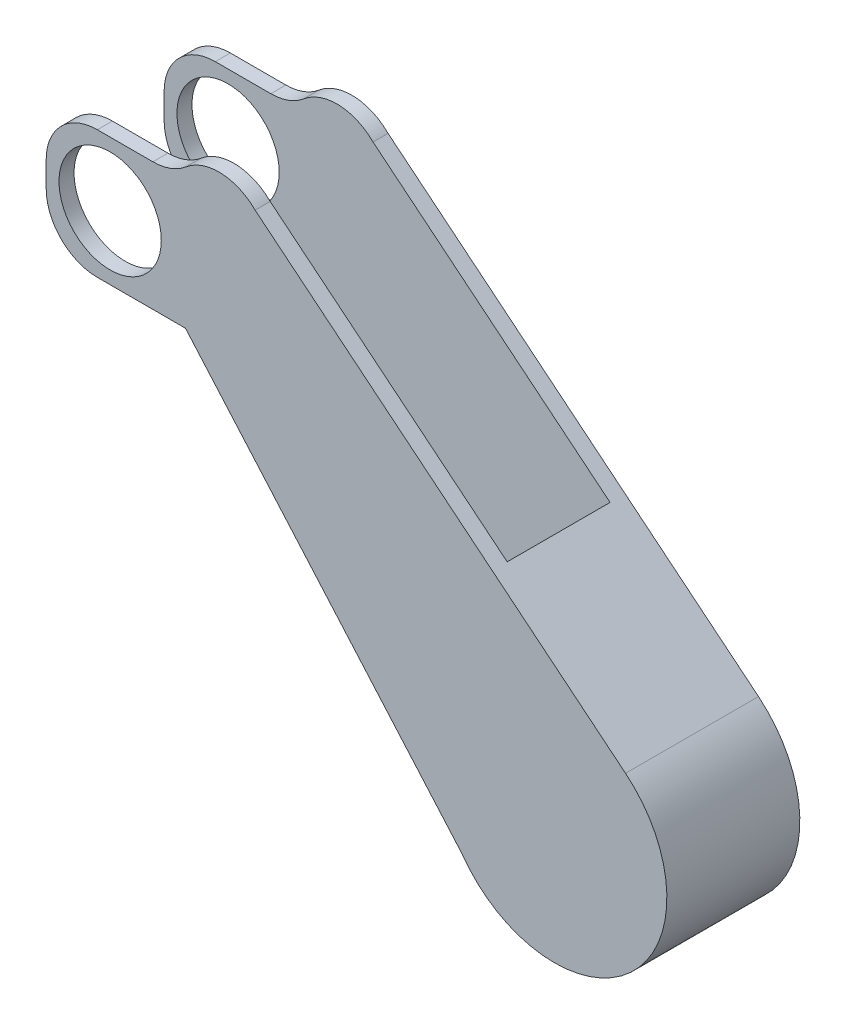
ISO-10303-21;
HEADER;
FILE_DESCRIPTION(('STEP AP214'),'2;1');
FILE_NAME('part.step','',(''),(''),'','','');
FILE_SCHEMA(('AUTOMOTIVE_DESIGN { 1 0 10303 214 1 1 1 1 }'));
ENDSEC;
DATA;
#1=APPLICATION_CONTEXT('core data for automotive mechanical design processes');
#2=APPLICATION_PROTOCOL_DEFINITION('international standard','automotive_design',2000,#1);
#3=PRODUCT_CONTEXT('',#1,'mechanical');
#4=PRODUCT('Part','Part','',(#3));
#5=PRODUCT_RELATED_PRODUCT_CATEGORY('part','',(#4));
#6=PRODUCT_DEFINITION_FORMATION('','',#4);
#7=PRODUCT_DEFINITION_CONTEXT('part definition',#1,'design');
#8=PRODUCT_DEFINITION('design','',#6,#7);
#9=PRODUCT_DEFINITION_SHAPE('','',#8);
#10=(LENGTH_UNIT() NAMED_UNIT(*) SI_UNIT(.MILLI.,.METRE.));
#11=(NAMED_UNIT(*) PLANE_ANGLE_UNIT() SI_UNIT($,.RADIAN.));
#12=(NAMED_UNIT(*) SI_UNIT($,.STERADIAN.) SOLID_ANGLE_UNIT());
#13=UNCERTAINTY_MEASURE_WITH_UNIT(LENGTH_MEASURE(1.E-05),#10,'distance_accuracy_value','');
#14=(GEOMETRIC_REPRESENTATION_CONTEXT(3) GLOBAL_UNCERTAINTY_ASSIGNED_CONTEXT((#13)) GLOBAL_UNIT_ASSIGNED_CONTEXT((#10,
#11,#12)) REPRESENTATION_CONTEXT('',''));
#15=CARTESIAN_POINT('',(0.,0.,0.));
#16=DIRECTION('',(0.,0.,1.));
#17=DIRECTION('',(1.,0.,0.));
#18=AXIS2_PLACEMENT_3D('',#15,#16,#17);
#19=CARTESIAN_POINT('',(39.3662760380528,-67.0535005180077,-136.560413984285));
#20=DIRECTION('',(-0.70710678118654,-0.707106781186555,0.));
#21=DIRECTION('',(0.707106781186555,-0.70710678118654,0.));
#22=AXIS2_PLACEMENT_3D('',#19,#20,#21);
#23=PLANE('',#22);
#24=DIRECTION('',(0.,0.,1.));
#25=VECTOR('',#24,1.);
#26=CARTESIAN_POINT('',(5.2757452228046,-32.9629697027602,-136.560413984285));
#27=LINE('',#26,#25);
#28=CARTESIAN_POINT('',(5.2757452228046,-32.9629697027602,2.94));
#29=VERTEX_POINT('',#28);
#30=CARTESIAN_POINT('',(5.27574522280459,-32.9629697027602,23.0584939563983));
#31=VERTEX_POINT('',#30);
#32=EDGE_CURVE('E463',#29,#31,#27,.T.);
#33=ORIENTED_EDGE('',*,*,#32,.F.);
#34=DIRECTION('',(-0.707106781186555,0.70710678118654,0.));
#35=VECTOR('',#34,1.);
#36=CARTESIAN_POINT('',(17.7267250611015,-45.4139495410568,2.94));
#37=LINE('',#36,#35);
#38=CARTESIAN_POINT('',(17.7267250611015,-45.4139495410568,2.94));
#39=VERTEX_POINT('',#38);
#40=EDGE_CURVE('E65',#39,#29,#37,.T.);
#41=ORIENTED_EDGE('',*,*,#40,.F.);
#42=DIRECTION('',(0.,0.,-1.));
#43=VECTOR('',#42,1.);
#44=CARTESIAN_POINT('',(17.7267250611015,-45.4139495410568,88.2253967444162));
#45=LINE('',#44,#43);
#46=CARTESIAN_POINT('',(17.7267250611015,-45.4139495410568,23.0584939563983));
#47=VERTEX_POINT('',#46);
#48=EDGE_CURVE('E470',#47,#39,#45,.T.);
#49=ORIENTED_EDGE('',*,*,#48,.F.);
#50=DIRECTION('',(0.707106781186555,-0.70710678118654,0.));
#51=VECTOR('',#50,1.);
#52=CARTESIAN_POINT('',(17.7267250611015,-45.4139495410568,23.0584939563983));
#53=LINE('',#52,#51);
#54=EDGE_CURVE('E251',#31,#47,#53,.T.);
#55=ORIENTED_EDGE('',*,*,#54,.F.);
#56=EDGE_LOOP('',(#33,#41,#49,#55));
#57=FACE_BOUND('',#56,.T.);
#58=ADVANCED_FACE('F41',(#57),#23,.T.);
#59=CARTESIAN_POINT('',(39.3662760380525,-49.3800349556613,88.2253967444162));
#60=DIRECTION('',(0.,0.,-1.));
#61=DIRECTION('',(-1.,0.,0.));
#62=AXIS2_PLACEMENT_3D('',#59,#60,#61);
#63=CYLINDRICAL_SURFACE('',#62,22.);
#64=DIRECTION('',(0.,0.,-1.));
#65=VECTOR('',#64,1.);
#66=CARTESIAN_POINT('',(21.3588905693733,-62.0186293625722,85.2536933444695));
#67=LINE('',#66,#65);
#68=CARTESIAN_POINT('',(21.3588905693733,-62.0186293625722,2.94));
#69=VERTEX_POINT('',#68);
#70=CARTESIAN_POINT('',(21.3588905693733,-62.0186293625722,0.));
#71=VERTEX_POINT('',#70);
#72=EDGE_CURVE('E237',#69,#71,#67,.T.);
#73=ORIENTED_EDGE('',*,*,#72,.T.);
#74=CARTESIAN_POINT('',(39.3662760380525,-49.3800349556613,0.));
#75=DIRECTION('',(0.,0.,-1.));
#76=DIRECTION('',(-1.,0.,0.));
#77=AXIS2_PLACEMENT_3D('',#74,#75,#76);
#78=CIRCLE('',#77,22.);
#79=CARTESIAN_POINT('',(53.2816079254222,-32.3399780759337,0.));
#80=VERTEX_POINT('',#79);
#81=EDGE_CURVE('E277',#80,#71,#78,.T.);
#82=ORIENTED_EDGE('',*,*,#81,.F.);
#83=DIRECTION('',(0.,0.,1.));
#84=VECTOR('',#83,1.);
#85=CARTESIAN_POINT('',(53.2816079254222,-32.3399780759337,-93.5129687313872));
#86=LINE('',#85,#84);
#87=CARTESIAN_POINT('',(53.2816079254222,-32.3399780759337,26.));
#88=VERTEX_POINT('',#87);
#89=EDGE_CURVE('E273',#80,#88,#86,.T.);
#90=ORIENTED_EDGE('',*,*,#89,.T.);
#91=CARTESIAN_POINT('',(39.3662760380525,-49.3800349556613,26.));
#92=DIRECTION('',(0.,0.,-1.));
#93=DIRECTION('',(-1.,0.,0.));
#94=AXIS2_PLACEMENT_3D('',#91,#92,#93);
#95=CIRCLE('',#94,22.);
#96=CARTESIAN_POINT('',(21.3588905693733,-62.0186293625722,26.));
#97=VERTEX_POINT('',#96);
#98=EDGE_CURVE('E281',#97,#88,#95,.F.);
#99=ORIENTED_EDGE('',*,*,#98,.F.);
#100=DIRECTION('',(0.,0.,1.));
#101=VECTOR('',#100,1.);
#102=CARTESIAN_POINT('',(21.3588905693733,-62.0186293625722,-59.2551993880713));
#103=LINE('',#102,#101);
#104=CARTESIAN_POINT('',(21.3588905693733,-62.0186293625722,23.0584939563983));
#105=VERTEX_POINT('',#104);
#106=EDGE_CURVE('E246',#105,#97,#103,.T.);
#107=ORIENTED_EDGE('',*,*,#106,.F.);
#108=CARTESIAN_POINT('',(39.3662760380525,-49.3800349556613,23.0584939563983));
#109=DIRECTION('',(0.,0.,1.));
#110=DIRECTION('',(1.,0.,0.));
#111=AXIS2_PLACEMENT_3D('',#108,#109,#110);
#112=CIRCLE('',#111,22.);
#113=EDGE_CURVE('E257',#47,#105,#112,.T.);
#114=ORIENTED_EDGE('',*,*,#113,.F.);
#115=ORIENTED_EDGE('',*,*,#48,.T.);
#116=CARTESIAN_POINT('',(39.3662760380525,-49.3800349556613,2.94));
#117=DIRECTION('',(0.,0.,-1.));
#118=DIRECTION('',(-1.,0.,0.));
#119=AXIS2_PLACEMENT_3D('',#116,#117,#118);
#120=CIRCLE('',#119,22.);
#121=EDGE_CURVE('E57',#69,#39,#120,.T.);
#122=ORIENTED_EDGE('',*,*,#121,.F.);
#123=EDGE_LOOP('',(#73,#82,#90,#99,#107,#114,#115,#122));
#124=FACE_BOUND('',#123,.T.);
#125=ADVANCED_FACE('F495',(#124),#63,.T.);
#126=CARTESIAN_POINT('',(0.,0.,26.));
#127=DIRECTION('',(0.,1.,0.));
#128=DIRECTION('',(0.,0.,1.));
#129=AXIS2_PLACEMENT_3D('',#126,#127,#128);
#130=PLANE('',#129);
#131=DIRECTION('',(1.,0.,0.));
#132=VECTOR('',#131,1.);
#133=CARTESIAN_POINT('',(0.,0.,0.));
#134=LINE('',#133,#132);
#135=CARTESIAN_POINT('',(-49.9982885156256,0.,0.));
#136=VERTEX_POINT('',#135);
#137=CARTESIAN_POINT('',(-32.7635052016498,0.,0.));
#138=VERTEX_POINT('',#137);
#139=EDGE_CURVE('E232',#136,#138,#134,.T.);
#140=ORIENTED_EDGE('',*,*,#139,.T.);
#141=DIRECTION('',(0.,0.,-1.));
#142=VECTOR('',#141,1.);
#143=CARTESIAN_POINT('',(-32.7635052016497,0.,85.2536933444695));
#144=LINE('',#143,#142);
#145=CARTESIAN_POINT('',(-32.7635052016497,0.,2.94));
#146=VERTEX_POINT('',#145);
#147=EDGE_CURVE('E229',#146,#138,#144,.T.);
#148=ORIENTED_EDGE('',*,*,#147,.F.);
#149=DIRECTION('',(-1.,0.,0.));
#150=VECTOR('',#149,1.);
#151=CARTESIAN_POINT('',(0.,0.,2.94));
#152=LINE('',#151,#150);
#153=CARTESIAN_POINT('',(-49.9982885156256,0.,2.94));
#154=VERTEX_POINT('',#153);
#155=EDGE_CURVE('E213',#146,#154,#152,.T.);
#156=ORIENTED_EDGE('',*,*,#155,.T.);
#157=DIRECTION('',(0.,0.,-1.));
#158=VECTOR('',#157,1.);
#159=CARTESIAN_POINT('',(-49.9982885156256,0.,26.));
#160=LINE('',#159,#158);
#161=EDGE_CURVE('E403',#154,#136,#160,.T.);
#162=ORIENTED_EDGE('',*,*,#161,.T.);
#163=EDGE_LOOP('',(#140,#148,#156,#162));
#164=FACE_BOUND('',#163,.T.);
#165=ADVANCED_FACE('F230',(#164),#130,.F.);
#166=CARTESIAN_POINT('',(-39.1410101234482,35.0029962844133,-136.560413984285));
#167=DIRECTION('',(0.,0.,1.));
#168=DIRECTION('',(1.,0.,0.));
#169=AXIS2_PLACEMENT_3D('',#166,#167,#168);
#170=CYLINDRICAL_SURFACE('',#169,10.);
#171=CARTESIAN_POINT('',(-39.1410101234482,35.0029962844133,2.94));
#172=DIRECTION('',(0.,0.,-1.));
#173=DIRECTION('',(-1.,0.,0.));
#174=AXIS2_PLACEMENT_3D('',#171,#172,#173);
#175=CIRCLE('',#174,10.);
#176=CARTESIAN_POINT('',(-32.6803783271054,27.3701569180906,2.94));
#177=VERTEX_POINT('',#176);
#178=CARTESIAN_POINT('',(-39.1410101234482,25.0029962844133,2.94));
#179=VERTEX_POINT('',#178);
#180=EDGE_CURVE('E435',#177,#179,#175,.T.);
#181=ORIENTED_EDGE('',*,*,#180,.F.);
#182=DIRECTION('',(0.,0.,1.));
#183=VECTOR('',#182,1.);
#184=CARTESIAN_POINT('',(-32.6803783271054,27.3701569180906,-136.560413984285));
#185=LINE('',#184,#183);
#186=CARTESIAN_POINT('',(-32.6803783271054,27.3701569180906,0.));
#187=VERTEX_POINT('',#186);
#188=EDGE_CURVE('E450',#177,#187,#185,.F.);
#189=ORIENTED_EDGE('',*,*,#188,.T.);
#190=CARTESIAN_POINT('',(-39.1410101234482,35.0029962844133,0.));
#191=DIRECTION('',(0.,0.,-1.));
#192=DIRECTION('',(-1.,0.,0.));
#193=AXIS2_PLACEMENT_3D('',#190,#191,#192);
#194=CIRCLE('',#193,10.);
#195=CARTESIAN_POINT('',(-39.1410101234482,25.0029962844133,0.));
#196=VERTEX_POINT('',#195);
#197=EDGE_CURVE('E438',#196,#187,#194,.F.);
#198=ORIENTED_EDGE('',*,*,#197,.F.);
#199=DIRECTION('',(0.,0.,1.));
#200=VECTOR('',#199,1.);
#201=CARTESIAN_POINT('',(-39.1410101234482,25.0029962844133,26.));
#202=LINE('',#201,#200);
#203=EDGE_CURVE('E425',#179,#196,#202,.F.);
#204=ORIENTED_EDGE('',*,*,#203,.F.);
#205=EDGE_LOOP('',(#181,#189,#198,#204));
#206=FACE_BOUND('',#205,.T.);
#207=ADVANCED_FACE('F571',(#206),#170,.F.);
#208=CARTESIAN_POINT('',(-26.2197465307626,19.7373175517679,-136.560413984285));
#209=DIRECTION('',(0.,0.,1.));
#210=DIRECTION('',(1.,0.,0.));
#211=AXIS2_PLACEMENT_3D('',#208,#209,#210);
#212=CYLINDRICAL_SURFACE('',#211,10.);
#213=CARTESIAN_POINT('',(-26.2197465307626,19.7373175517679,2.94));
#214=DIRECTION('',(0.,0.,-1.));
#215=DIRECTION('',(-1.,0.,0.));
#216=AXIS2_PLACEMENT_3D('',#213,#214,#215);
#217=CIRCLE('',#216,10.);
#218=CARTESIAN_POINT('',(-19.1486787188972,26.8083853636334,2.94));
#219=VERTEX_POINT('',#218);
#220=EDGE_CURVE('E303',#219,#177,#217,.F.);
#221=ORIENTED_EDGE('',*,*,#220,.F.);
#222=DIRECTION('',(0.,0.,-1.));
#223=VECTOR('',#222,1.);
#224=CARTESIAN_POINT('',(-19.1486787188972,26.8083853636335,26.));
#225=LINE('',#224,#223);
#226=CARTESIAN_POINT('',(-19.1486787188972,26.8083853636335,0.));
#227=VERTEX_POINT('',#226);
#228=EDGE_CURVE('E443',#227,#219,#225,.F.);
#229=ORIENTED_EDGE('',*,*,#228,.F.);
#230=CARTESIAN_POINT('',(-26.2197465307626,19.7373175517679,0.));
#231=DIRECTION('',(0.,0.,-1.));
#232=DIRECTION('',(-1.,0.,0.));
#233=AXIS2_PLACEMENT_3D('',#230,#231,#232);
#234=CIRCLE('',#233,10.);
#235=EDGE_CURVE('E455',#187,#227,#234,.T.);
#236=ORIENTED_EDGE('',*,*,#235,.F.);
#237=ORIENTED_EDGE('',*,*,#188,.F.);
#238=EDGE_LOOP('',(#221,#229,#236,#237));
#239=FACE_BOUND('',#238,.T.);
#240=ADVANCED_FACE('F565',(#239),#212,.T.);
#241=CARTESIAN_POINT('',(-59.9982885156256,25.0029962844133,26.));
#242=DIRECTION('',(0.,-1.,0.));
#243=DIRECTION('',(0.,0.,-1.));
#244=AXIS2_PLACEMENT_3D('',#241,#242,#243);
#245=PLANE('',#244);
#246=DIRECTION('',(0.,0.,1.));
#247=VECTOR('',#246,1.);
#248=CARTESIAN_POINT('',(-39.1410101234482,25.0029962844133,26.));
#249=LINE('',#248,#247);
#250=CARTESIAN_POINT('',(-39.1410101234482,25.0029962844133,26.));
#251=VERTEX_POINT('',#250);
#252=CARTESIAN_POINT('',(-39.1410101234482,25.0029962844133,23.0591974399467));
#253=VERTEX_POINT('',#252);
#254=EDGE_CURVE('E428',#251,#253,#249,.F.);
#255=ORIENTED_EDGE('',*,*,#254,.T.);
#256=DIRECTION('',(-0.999999998568549,0.,5.35060937209607E-05));
#257=VECTOR('',#256,1.);
#258=CARTESIAN_POINT('',(-59.9984458067704,25.0029962844133,23.0603134398568));
#259=LINE('',#258,#257);
#260=CARTESIAN_POINT('',(-42.142993302298,25.0029962844133,23.0593580643403));
#261=VERTEX_POINT('',#260);
#262=EDGE_CURVE('E292',#253,#261,#259,.T.);
#263=ORIENTED_EDGE('',*,*,#262,.T.);
#264=DIRECTION('',(0.,0.,-1.));
#265=VECTOR('',#264,1.);
#266=CARTESIAN_POINT('',(-42.142993302298,25.0029962844133,23.06));
#267=LINE('',#266,#265);
#268=CARTESIAN_POINT('',(-42.142993302298,25.0029962844133,23.06));
#269=VERTEX_POINT('',#268);
#270=EDGE_CURVE('E312',#269,#261,#267,.T.);
#271=ORIENTED_EDGE('',*,*,#270,.F.);
#272=DIRECTION('',(-1.,0.,0.));
#273=VECTOR('',#272,1.);
#274=CARTESIAN_POINT('',(-59.9982885156256,25.0029962844133,23.06));
#275=LINE('',#274,#273);
#276=CARTESIAN_POINT('',(-49.9982885156256,25.0029962844133,23.06));
#277=VERTEX_POINT('',#276);
#278=EDGE_CURVE('E421',#269,#277,#275,.T.);
#279=ORIENTED_EDGE('',*,*,#278,.T.);
#280=DIRECTION('',(0.,0.,-1.));
#281=VECTOR('',#280,1.);
#282=CARTESIAN_POINT('',(-49.9982885156256,25.0029962844133,26.));
#283=LINE('',#282,#281);
#284=CARTESIAN_POINT('',(-49.9982885156256,25.0029962844133,26.));
#285=VERTEX_POINT('',#284);
#286=EDGE_CURVE('E395',#277,#285,#283,.F.);
#287=ORIENTED_EDGE('',*,*,#286,.T.);
#288=DIRECTION('',(-1.,0.,0.));
#289=VECTOR('',#288,1.);
#290=CARTESIAN_POINT('',(-59.9982885156256,25.0029962844133,26.));
#291=LINE('',#290,#289);
#292=EDGE_CURVE('E370',#251,#285,#291,.T.);
#293=ORIENTED_EDGE('',*,*,#292,.F.);
#294=EDGE_LOOP('',(#255,#263,#271,#279,#287,#293));
#295=FACE_BOUND('',#294,.T.);
#296=ADVANCED_FACE('F540',(#295),#245,.F.);
#297=DIRECTION('',(1.,0.,0.));
#298=VECTOR('',#297,1.);
#299=CARTESIAN_POINT('',(0.,0.,23.0584939563983));
#300=LINE('',#299,#298);
#301=CARTESIAN_POINT('',(-42.142993302298,0.,23.0584939563983));
#302=VERTEX_POINT('',#301);
#303=CARTESIAN_POINT('',(-32.7635052016498,0.,23.0584939563983));
#304=VERTEX_POINT('',#303);
#305=EDGE_CURVE('E354',#302,#304,#300,.T.);
#306=ORIENTED_EDGE('',*,*,#305,.T.);
#307=DIRECTION('',(0.,0.,1.));
#308=VECTOR('',#307,1.);
#309=CARTESIAN_POINT('',(-32.7635052016498,0.,-59.2551993880713));
#310=LINE('',#309,#308);
#311=CARTESIAN_POINT('',(-32.7635052016498,0.,26.));
#312=VERTEX_POINT('',#311);
#313=EDGE_CURVE('E255',#304,#312,#310,.T.);
#314=ORIENTED_EDGE('',*,*,#313,.T.);
#315=DIRECTION('',(1.,0.,0.));
#316=VECTOR('',#315,1.);
#317=CARTESIAN_POINT('',(0.,0.,26.));
#318=LINE('',#317,#316);
#319=CARTESIAN_POINT('',(-49.9982885156256,0.,26.));
#320=VERTEX_POINT('',#319);
#321=EDGE_CURVE('E366',#320,#312,#318,.T.);
#322=ORIENTED_EDGE('',*,*,#321,.F.);
#323=CARTESIAN_POINT('',(-49.9982885156256,0.,23.06));
#324=VERTEX_POINT('',#323);
#325=EDGE_CURVE('E404',#320,#324,#160,.T.);
#326=ORIENTED_EDGE('',*,*,#325,.T.);
#327=DIRECTION('',(1.,0.,0.));
#328=VECTOR('',#327,1.);
#329=CARTESIAN_POINT('',(0.,0.,23.06));
#330=LINE('',#329,#328);
#331=CARTESIAN_POINT('',(-42.142993302298,0.,23.06));
#332=VERTEX_POINT('',#331);
#333=EDGE_CURVE('E334',#324,#332,#330,.T.);
#334=ORIENTED_EDGE('',*,*,#333,.T.);
#335=DIRECTION('',(0.,0.,-1.));
#336=VECTOR('',#335,1.);
#337=CARTESIAN_POINT('',(-42.142993302298,0.,23.06));
#338=LINE('',#337,#336);
#339=EDGE_CURVE('E316',#302,#332,#338,.F.);
#340=ORIENTED_EDGE('',*,*,#339,.F.);
#341=EDGE_LOOP('',(#306,#314,#322,#326,#334,#340));
#342=FACE_BOUND('',#341,.T.);
#343=ADVANCED_FACE('F514',(#342),#130,.F.);
#344=DIRECTION('',(-1.,0.,0.));
#345=VECTOR('',#344,1.);
#346=CARTESIAN_POINT('',(-37.5014719281598,25.0029962844133,2.94));
#347=LINE('',#346,#345);
#348=CARTESIAN_POINT('',(-49.9982885156256,25.0029962844133,2.94));
#349=VERTEX_POINT('',#348);
#350=EDGE_CURVE('E342',#179,#349,#347,.T.);
#351=ORIENTED_EDGE('',*,*,#350,.F.);
#352=ORIENTED_EDGE('',*,*,#203,.T.);
#353=DIRECTION('',(-1.,0.,0.));
#354=VECTOR('',#353,1.);
#355=CARTESIAN_POINT('',(-59.9982885156256,25.0029962844133,0.));
#356=LINE('',#355,#354);
#357=CARTESIAN_POINT('',(-49.9982885156256,25.0029962844133,0.));
#358=VERTEX_POINT('',#357);
#359=EDGE_CURVE('E381',#196,#358,#356,.T.);
#360=ORIENTED_EDGE('',*,*,#359,.T.);
#361=EDGE_CURVE('E396',#358,#349,#283,.F.);
#362=ORIENTED_EDGE('',*,*,#361,.T.);
#363=EDGE_LOOP('',(#351,#352,#360,#362));
#364=FACE_BOUND('',#363,.T.);
#365=ADVANCED_FACE('F605',(#364),#245,.F.);
#366=CARTESIAN_POINT('',(-59.9982885156256,0.,26.));
#367=DIRECTION('',(1.,0.,0.));
#368=DIRECTION('',(0.,0.,-1.));
#369=AXIS2_PLACEMENT_3D('',#366,#367,#368);
#370=PLANE('',#369);
#371=DIRECTION('',(0.,0.,-1.));
#372=VECTOR('',#371,1.);
#373=CARTESIAN_POINT('',(-59.9982885156256,15.0029962844133,26.));
#374=LINE('',#373,#372);
#375=CARTESIAN_POINT('',(-59.9982885156256,15.0029962844133,26.));
#376=VERTEX_POINT('',#375);
#377=CARTESIAN_POINT('',(-59.9982885156256,15.0029962844133,23.06));
#378=VERTEX_POINT('',#377);
#379=EDGE_CURVE('E387',#376,#378,#374,.T.);
#380=ORIENTED_EDGE('',*,*,#379,.T.);
#381=DIRECTION('',(0.,-1.,0.));
#382=VECTOR('',#381,1.);
#383=CARTESIAN_POINT('',(-59.9982885156256,0.,23.06));
#384=LINE('',#383,#382);
#385=CARTESIAN_POINT('',(-59.9982885156256,10.,23.06));
#386=VERTEX_POINT('',#385);
#387=EDGE_CURVE('E327',#378,#386,#384,.T.);
#388=ORIENTED_EDGE('',*,*,#387,.T.);
#389=DIRECTION('',(0.,0.,-1.));
#390=VECTOR('',#389,1.);
#391=CARTESIAN_POINT('',(-59.9982885156256,10.,26.));
#392=LINE('',#391,#390);
#393=CARTESIAN_POINT('',(-59.9982885156256,10.,26.));
#394=VERTEX_POINT('',#393);
#395=EDGE_CURVE('E411',#386,#394,#392,.F.);
#396=ORIENTED_EDGE('',*,*,#395,.T.);
#397=DIRECTION('',(0.,-1.,0.));
#398=VECTOR('',#397,1.);
#399=CARTESIAN_POINT('',(-59.9982885156256,0.,26.));
#400=LINE('',#399,#398);
#401=EDGE_CURVE('E374',#376,#394,#400,.T.);
#402=ORIENTED_EDGE('',*,*,#401,.F.);
#403=EDGE_LOOP('',(#380,#388,#396,#402));
#404=FACE_BOUND('',#403,.T.);
#405=ADVANCED_FACE('F548',(#404),#370,.F.);
#406=CARTESIAN_POINT('',(-47.4976682878041,12.5014981422066,0.));
#407=DIRECTION('',(0.,0.,1.));
#408=DIRECTION('',(1.,0.,0.));
#409=AXIS2_PLACEMENT_3D('',#406,#407,#408);
#410=CYLINDRICAL_SURFACE('',#409,9.99691088357375);
#411=CARTESIAN_POINT('',(-47.4976682878041,12.5014981422066,23.06));
#412=DIRECTION('',(0.,0.,1.));
#413=DIRECTION('',(1.,0.,0.));
#414=AXIS2_PLACEMENT_3D('',#411,#412,#413);
#415=CIRCLE('',#414,9.99691088357375);
#416=CARTESIAN_POINT('',(-37.5007574042303,12.5014981422066,23.06));
#417=VERTEX_POINT('',#416);
#418=EDGE_CURVE('E338',#417,#417,#415,.F.);
#419=CARTESIAN_POINT('',(-47.4976682878041,12.5014981422066,26.));
#420=DIRECTION('',(0.,0.,1.));
#421=DIRECTION('',(1.,0.,0.));
#422=AXIS2_PLACEMENT_3D('',#419,#420,#421);
#423=CIRCLE('',#422,9.99691088357375);
#424=CARTESIAN_POINT('',(-37.5007574042303,12.5014981422066,26.));
#425=VERTEX_POINT('',#424);
#426=EDGE_CURVE('E358',#425,#425,#423,.T.);
#427=CARTESIAN_POINT('',(-37.5007574042303,12.5014981422066,23.06));
#428=CARTESIAN_POINT('',(-37.5007574042303,12.5014981422066,23.090625));
#429=CARTESIAN_POINT('',(-37.5007574042303,12.5014981422066,23.12125));
#430=CARTESIAN_POINT('',(-37.5007574042303,12.5014981422066,23.1825));
#431=CARTESIAN_POINT('',(-37.5007574042303,12.5014981422066,23.213125));
#432=CARTESIAN_POINT('',(-37.5007574042303,12.5014981422066,23.274375));
#433=CARTESIAN_POINT('',(-37.5007574042303,12.5014981422066,23.305));
#434=CARTESIAN_POINT('',(-37.5007574042303,12.5014981422066,23.36625));
#435=CARTESIAN_POINT('',(-37.5007574042303,12.5014981422066,23.396875));
#436=CARTESIAN_POINT('',(-37.5007574042303,12.5014981422066,23.458125));
#437=CARTESIAN_POINT('',(-37.5007574042303,12.5014981422066,23.48875));
#438=CARTESIAN_POINT('',(-37.5007574042303,12.5014981422066,23.55));
#439=CARTESIAN_POINT('',(-37.5007574042303,12.5014981422066,23.580625));
#440=CARTESIAN_POINT('',(-37.5007574042303,12.5014981422066,23.641875));
#441=CARTESIAN_POINT('',(-37.5007574042303,12.5014981422066,23.6725));
#442=CARTESIAN_POINT('',(-37.5007574042303,12.5014981422066,23.73375));
#443=CARTESIAN_POINT('',(-37.5007574042303,12.5014981422066,23.764375));
#444=CARTESIAN_POINT('',(-37.5007574042303,12.5014981422066,23.825625));
#445=CARTESIAN_POINT('',(-37.5007574042303,12.5014981422066,23.85625));
#446=CARTESIAN_POINT('',(-37.5007574042303,12.5014981422066,23.9175));
#447=CARTESIAN_POINT('',(-37.5007574042303,12.5014981422066,23.948125));
#448=CARTESIAN_POINT('',(-37.5007574042303,12.5014981422066,24.009375));
#449=CARTESIAN_POINT('',(-37.5007574042303,12.5014981422066,24.04));
#450=CARTESIAN_POINT('',(-37.5007574042303,12.5014981422066,24.10125));
#451=CARTESIAN_POINT('',(-37.5007574042303,12.5014981422066,24.131875));
#452=CARTESIAN_POINT('',(-37.5007574042303,12.5014981422066,24.193125));
#453=CARTESIAN_POINT('',(-37.5007574042303,12.5014981422066,24.22375));
#454=CARTESIAN_POINT('',(-37.5007574042303,12.5014981422066,24.285));
#455=CARTESIAN_POINT('',(-37.5007574042303,12.5014981422066,24.315625));
#456=CARTESIAN_POINT('',(-37.5007574042303,12.5014981422066,24.376875));
#457=CARTESIAN_POINT('',(-37.5007574042303,12.5014981422066,24.4075));
#458=CARTESIAN_POINT('',(-37.5007574042303,12.5014981422066,24.46875));
#459=CARTESIAN_POINT('',(-37.5007574042303,12.5014981422066,24.499375));
#460=CARTESIAN_POINT('',(-37.5007574042303,12.5014981422066,24.560625));
#461=CARTESIAN_POINT('',(-37.5007574042303,12.5014981422066,24.59125));
#462=CARTESIAN_POINT('',(-37.5007574042303,12.5014981422066,24.6525));
#463=CARTESIAN_POINT('',(-37.5007574042303,12.5014981422066,24.683125));
#464=CARTESIAN_POINT('',(-37.5007574042303,12.5014981422066,24.744375));
#465=CARTESIAN_POINT('',(-37.5007574042303,12.5014981422066,24.775));
#466=CARTESIAN_POINT('',(-37.5007574042303,12.5014981422066,24.83625));
#467=CARTESIAN_POINT('',(-37.5007574042303,12.5014981422066,24.866875));
#468=CARTESIAN_POINT('',(-37.5007574042303,12.5014981422066,24.928125));
#469=CARTESIAN_POINT('',(-37.5007574042303,12.5014981422066,24.95875));
#470=CARTESIAN_POINT('',(-37.5007574042303,12.5014981422066,25.02));
#471=CARTESIAN_POINT('',(-37.5007574042303,12.5014981422066,25.050625));
#472=CARTESIAN_POINT('',(-37.5007574042303,12.5014981422066,25.111875));
#473=CARTESIAN_POINT('',(-37.5007574042303,12.5014981422066,25.1425));
#474=CARTESIAN_POINT('',(-37.5007574042303,12.5014981422066,25.20375));
#475=CARTESIAN_POINT('',(-37.5007574042303,12.5014981422066,25.234375));
#476=CARTESIAN_POINT('',(-37.5007574042303,12.5014981422066,25.295625));
#477=CARTESIAN_POINT('',(-37.5007574042303,12.5014981422066,25.32625));
#478=CARTESIAN_POINT('',(-37.5007574042303,12.5014981422066,25.3875));
#479=CARTESIAN_POINT('',(-37.5007574042303,12.5014981422066,25.418125));
#480=CARTESIAN_POINT('',(-37.5007574042303,12.5014981422066,25.479375));
#481=CARTESIAN_POINT('',(-37.5007574042303,12.5014981422066,25.51));
#482=CARTESIAN_POINT('',(-37.5007574042303,12.5014981422066,25.57125));
#483=CARTESIAN_POINT('',(-37.5007574042303,12.5014981422066,25.601875));
#484=CARTESIAN_POINT('',(-37.5007574042303,12.5014981422066,25.663125));
#485=CARTESIAN_POINT('',(-37.5007574042303,12.5014981422066,25.69375));
#486=CARTESIAN_POINT('',(-37.5007574042303,12.5014981422066,25.755));
#487=CARTESIAN_POINT('',(-37.5007574042303,12.5014981422066,25.785625));
#488=CARTESIAN_POINT('',(-37.5007574042303,12.5014981422066,25.846875));
#489=CARTESIAN_POINT('',(-37.5007574042303,12.5014981422066,25.8775));
#490=CARTESIAN_POINT('',(-37.5007574042303,12.5014981422066,25.93875));
#491=CARTESIAN_POINT('',(-37.5007574042303,12.5014981422066,25.969375));
#492=CARTESIAN_POINT('',(-37.5007574042303,12.5014981422066,26.));
#493=B_SPLINE_CURVE_WITH_KNOTS('',3,(#427,#428,#429,#430,#431,#432,#433,#434,#435,#436,#437,
#438,#439,#440,#441,#442,#443,#444,#445,#446,#447,#448,#449,#450,#451,#452,#453,#454,#455,#456,
#457,#458,#459,#460,#461,#462,#463,#464,#465,#466,#467,#468,#469,#470,#471,#472,#473,#474,#475,
#476,#477,#478,#479,#480,#481,#482,#483,#484,#485,#486,#487,#488,#489,#490,#491,#492),
.UNSPECIFIED.,.F.,.F.,(4,2,2,2,2,2,2,2,2,2,2,2,2,2,2,2,2,2,2,2,2,2,2,2,2,2,2,2,2,2,2,2,4),(0.,
0.0918749999999982,0.18375,0.275625000000002,0.3675,0.459374999999998,0.55125,0.643125000000001,
0.735,0.826874999999998,0.918749999999999,1.010625,1.1025,1.194375,1.28625,1.378125,1.47,
1.561875,1.65375,1.745625,1.8375,1.929375,2.02125,2.113125,2.205,2.296875,2.38875,2.480625,
2.5725,2.664375,2.75625,2.848125,2.94),.UNSPECIFIED.);
#494=EDGE_CURVE('BSEAM596',#417,#425,#493,.T.);
#495=ORIENTED_EDGE('',*,*,#418,.T.);
#496=ORIENTED_EDGE('',*,*,#426,.T.);
#497=ORIENTED_EDGE('',*,*,#494,.T.);
#498=ORIENTED_EDGE('',*,*,#494,.F.);
#499=EDGE_LOOP('',(#495,#497,#496,#498));
#500=FACE_BOUND('',#499,.T.);
#501=ADVANCED_FACE('F596',(#500),#410,.F.);
#502=CARTESIAN_POINT('',(-49.9982885156256,15.0029962844133,26.));
#503=DIRECTION('',(0.,0.,-1.));
#504=DIRECTION('',(-1.,0.,0.));
#505=AXIS2_PLACEMENT_3D('',#502,#503,#504);
#506=CYLINDRICAL_SURFACE('',#505,10.);
#507=CARTESIAN_POINT('',(-49.9982885156256,15.0029962844133,23.06));
#508=DIRECTION('',(0.,0.,1.));
#509=DIRECTION('',(1.,0.,0.));
#510=AXIS2_PLACEMENT_3D('',#507,#508,#509);
#511=CIRCLE('',#510,10.);
#512=CARTESIAN_POINT('',(-57.0693563274911,22.0740640962787,23.06));
#513=VERTEX_POINT('',#512);
#514=EDGE_CURVE('E323',#378,#513,#511,.F.);
#515=ORIENTED_EDGE('',*,*,#514,.F.);
#516=ORIENTED_EDGE('',*,*,#379,.F.);
#517=CARTESIAN_POINT('',(-49.9982885156256,15.0029962844133,26.));
#518=DIRECTION('',(0.,0.,-1.));
#519=DIRECTION('',(-1.,0.,0.));
#520=AXIS2_PLACEMENT_3D('',#517,#518,#519);
#521=CIRCLE('',#520,10.);
#522=EDGE_CURVE('E400',#285,#376,#521,.F.);
#523=ORIENTED_EDGE('',*,*,#522,.F.);
#524=ORIENTED_EDGE('',*,*,#286,.F.);
#525=EDGE_CURVE('E322',#513,#277,#511,.F.);
#526=ORIENTED_EDGE('',*,*,#525,.F.);
#527=EDGE_LOOP('',(#515,#516,#523,#524,#526));
#528=FACE_BOUND('',#527,.T.);
#529=ADVANCED_FACE('F543',(#528),#506,.T.);
#530=CARTESIAN_POINT('',(-49.9982885156256,10.,26.));
#531=DIRECTION('',(0.,0.,-1.));
#532=DIRECTION('',(-1.,0.,0.));
#533=AXIS2_PLACEMENT_3D('',#530,#531,#532);
#534=CYLINDRICAL_SURFACE('',#533,10.);
#535=CARTESIAN_POINT('',(-49.9982885156256,10.,23.06));
#536=DIRECTION('',(0.,0.,1.));
#537=DIRECTION('',(1.,0.,0.));
#538=AXIS2_PLACEMENT_3D('',#535,#536,#537);
#539=CIRCLE('',#538,10.);
#540=EDGE_CURVE('E331',#324,#386,#539,.F.);
#541=ORIENTED_EDGE('',*,*,#540,.F.);
#542=ORIENTED_EDGE('',*,*,#325,.F.);
#543=CARTESIAN_POINT('',(-49.9982885156256,10.,26.));
#544=DIRECTION('',(0.,0.,-1.));
#545=DIRECTION('',(-1.,0.,0.));
#546=AXIS2_PLACEMENT_3D('',#543,#544,#545);
#547=CIRCLE('',#546,10.);
#548=EDGE_CURVE('E416',#394,#320,#547,.F.);
#549=ORIENTED_EDGE('',*,*,#548,.F.);
#550=ORIENTED_EDGE('',*,*,#395,.F.);
#551=EDGE_LOOP('',(#541,#542,#549,#550));
#552=FACE_BOUND('',#551,.T.);
#553=ADVANCED_FACE('F552',(#552),#534,.T.);
#554=CARTESIAN_POINT('',(-59.9982885156256,10.,0.));
#555=VERTEX_POINT('',#554);
#556=CARTESIAN_POINT('',(-59.9982885156256,10.,2.94));
#557=VERTEX_POINT('',#556);
#558=EDGE_CURVE('E412',#555,#557,#392,.F.);
#559=ORIENTED_EDGE('',*,*,#558,.T.);
#560=DIRECTION('',(0.,1.,0.));
#561=VECTOR('',#560,1.);
#562=CARTESIAN_POINT('',(-59.9982885156256,0.,2.94));
#563=LINE('',#562,#561);
#564=CARTESIAN_POINT('',(-59.9982885156256,15.0029962844133,2.94));
#565=VERTEX_POINT('',#564);
#566=EDGE_CURVE('E226',#557,#565,#563,.T.);
#567=ORIENTED_EDGE('',*,*,#566,.T.);
#568=CARTESIAN_POINT('',(-59.9982885156256,15.0029962844133,0.));
#569=VERTEX_POINT('',#568);
#570=EDGE_CURVE('E378',#565,#569,#374,.T.);
#571=ORIENTED_EDGE('',*,*,#570,.T.);
#572=DIRECTION('',(0.,-1.,0.));
#573=VECTOR('',#572,1.);
#574=CARTESIAN_POINT('',(-59.9982885156256,0.,0.));
#575=LINE('',#574,#573);
#576=EDGE_CURVE('E371',#569,#555,#575,.T.);
#577=ORIENTED_EDGE('',*,*,#576,.T.);
#578=EDGE_LOOP('',(#559,#567,#571,#577));
#579=FACE_BOUND('',#578,.T.);
#580=ADVANCED_FACE('F599',(#579),#370,.F.);
#581=CARTESIAN_POINT('',(0.,0.,26.));
#582=DIRECTION('',(0.,0.,-1.));
#583=DIRECTION('',(-1.,0.,0.));
#584=AXIS2_PLACEMENT_3D('',#581,#582,#583);
#585=PLANE('',#584);
#586=ORIENTED_EDGE('',*,*,#321,.T.);
#587=DIRECTION('',(0.657513878578253,-0.753442432755803,0.));
#588=VECTOR('',#587,1.);
#589=CARTESIAN_POINT('',(-32.7635052016498,0.,26.));
#590=LINE('',#589,#588);
#591=EDGE_CURVE('E241',#312,#97,#590,.T.);
#592=ORIENTED_EDGE('',*,*,#591,.T.);
#593=ORIENTED_EDGE('',*,*,#98,.T.);
#594=DIRECTION('',(-0.774548039987619,0.632515085789531,0.));
#595=VECTOR('',#594,1.);
#596=CARTESIAN_POINT('',(53.2816079254222,-32.3399780759337,26.));
#597=LINE('',#596,#595);
#598=CARTESIAN_POINT('',(-19.1486787188972,26.8083853636335,26.));
#599=VERTEX_POINT('',#598);
#600=EDGE_CURVE('E266',#88,#599,#597,.T.);
#601=ORIENTED_EDGE('',*,*,#600,.T.);
#602=CARTESIAN_POINT('',(-26.2197465307626,19.7373175517679,26.));
#603=DIRECTION('',(0.,0.,-1.));
#604=DIRECTION('',(-1.,0.,0.));
#605=AXIS2_PLACEMENT_3D('',#602,#603,#604);
#606=CIRCLE('',#605,10.);
#607=CARTESIAN_POINT('',(-32.6803783271054,27.3701569180906,26.));
#608=VERTEX_POINT('',#607);
#609=EDGE_CURVE('E447',#599,#608,#606,.F.);
#610=ORIENTED_EDGE('',*,*,#609,.T.);
#611=CARTESIAN_POINT('',(-39.1410101234482,35.0029962844133,26.));
#612=DIRECTION('',(0.,0.,-1.));
#613=DIRECTION('',(-1.,0.,0.));
#614=AXIS2_PLACEMENT_3D('',#611,#612,#613);
#615=CIRCLE('',#614,10.);
#616=EDGE_CURVE('E432',#608,#251,#615,.T.);
#617=ORIENTED_EDGE('',*,*,#616,.T.);
#618=ORIENTED_EDGE('',*,*,#292,.T.);
#619=ORIENTED_EDGE('',*,*,#522,.T.);
#620=ORIENTED_EDGE('',*,*,#401,.T.);
#621=ORIENTED_EDGE('',*,*,#548,.T.);
#622=EDGE_LOOP('',(#586,#592,#593,#601,#610,#617,#618,#619,#620,#621));
#623=FACE_BOUND('',#622,.T.);
#624=ORIENTED_EDGE('',*,*,#426,.F.);
#625=EDGE_LOOP('',(#624));
#626=FACE_BOUND('',#625,.T.);
#627=ADVANCED_FACE('F505',(#623,#626),#585,.F.);
#628=CARTESIAN_POINT('',(0.,0.,0.));
#629=DIRECTION('',(0.,0.,-1.));
#630=DIRECTION('',(-1.,0.,0.));
#631=AXIS2_PLACEMENT_3D('',#628,#629,#630);
#632=PLANE('',#631);
#633=ORIENTED_EDGE('',*,*,#81,.T.);
#634=DIRECTION('',(-0.657513878578253,0.753442432755803,0.));
#635=VECTOR('',#634,1.);
#636=CARTESIAN_POINT('',(-32.7635052016497,0.,0.));
#637=LINE('',#636,#635);
#638=EDGE_CURVE('E490',#71,#138,#637,.T.);
#639=ORIENTED_EDGE('',*,*,#638,.T.);
#640=ORIENTED_EDGE('',*,*,#139,.F.);
#641=CARTESIAN_POINT('',(-49.9982885156256,10.,0.));
#642=DIRECTION('',(0.,0.,-1.));
#643=DIRECTION('',(-1.,0.,0.));
#644=AXIS2_PLACEMENT_3D('',#641,#642,#643);
#645=CIRCLE('',#644,10.);
#646=EDGE_CURVE('E408',#136,#555,#645,.T.);
#647=ORIENTED_EDGE('',*,*,#646,.T.);
#648=ORIENTED_EDGE('',*,*,#576,.F.);
#649=CARTESIAN_POINT('',(-49.9982885156256,15.0029962844133,0.));
#650=DIRECTION('',(0.,0.,-1.));
#651=DIRECTION('',(-1.,0.,0.));
#652=AXIS2_PLACEMENT_3D('',#649,#650,#651);
#653=CIRCLE('',#652,10.);
#654=EDGE_CURVE('E391',#569,#358,#653,.T.);
#655=ORIENTED_EDGE('',*,*,#654,.T.);
#656=ORIENTED_EDGE('',*,*,#359,.F.);
#657=ORIENTED_EDGE('',*,*,#197,.T.);
#658=ORIENTED_EDGE('',*,*,#235,.T.);
#659=DIRECTION('',(-0.774548039987619,0.632515085789531,0.));
#660=VECTOR('',#659,1.);
#661=CARTESIAN_POINT('',(53.2816079254222,-32.3399780759337,0.));
#662=LINE('',#661,#660);
#663=EDGE_CURVE('E270',#80,#227,#662,.T.);
#664=ORIENTED_EDGE('',*,*,#663,.F.);
#665=EDGE_LOOP('',(#633,#639,#640,#647,#648,#655,#656,#657,#658,#664));
#666=FACE_BOUND('',#665,.T.);
#667=CARTESIAN_POINT('',(-47.4976682878041,12.5014981422066,0.));
#668=DIRECTION('',(0.,0.,1.));
#669=DIRECTION('',(1.,0.,0.));
#670=AXIS2_PLACEMENT_3D('',#667,#668,#669);
#671=CIRCLE('',#670,9.99691088357375);
#672=CARTESIAN_POINT('',(-37.5007574042303,12.5014981422066,0.));
#673=VERTEX_POINT('',#672);
#674=EDGE_CURVE('E359',#673,#673,#671,.T.);
#675=ORIENTED_EDGE('',*,*,#674,.T.);
#676=EDGE_LOOP('',(#675));
#677=FACE_BOUND('',#676,.T.);
#678=ADVANCED_FACE('F496',(#666,#677),#632,.T.);
#679=CARTESIAN_POINT('',(-47.4976682878041,12.5014981422066,2.94));
#680=DIRECTION('',(0.,0.,-1.));
#681=DIRECTION('',(-1.,0.,0.));
#682=AXIS2_PLACEMENT_3D('',#679,#680,#681);
#683=CIRCLE('',#682,9.99691088357375);
#684=CARTESIAN_POINT('',(-37.5007574042303,12.5014981422066,2.94));
#685=VERTEX_POINT('',#684);
#686=EDGE_CURVE('E350',#685,#685,#683,.F.);
#687=CARTESIAN_POINT('',(-37.5007574042303,12.5014981422066,2.94));
#688=CARTESIAN_POINT('',(-37.5007574042303,12.5014981422066,2.909375));
#689=CARTESIAN_POINT('',(-37.5007574042303,12.5014981422066,2.87875));
#690=CARTESIAN_POINT('',(-37.5007574042303,12.5014981422066,2.8175));
#691=CARTESIAN_POINT('',(-37.5007574042303,12.5014981422066,2.786875));
#692=CARTESIAN_POINT('',(-37.5007574042303,12.5014981422066,2.725625));
#693=CARTESIAN_POINT('',(-37.5007574042303,12.5014981422066,2.695));
#694=CARTESIAN_POINT('',(-37.5007574042303,12.5014981422066,2.63375));
#695=CARTESIAN_POINT('',(-37.5007574042303,12.5014981422066,2.603125));
#696=CARTESIAN_POINT('',(-37.5007574042303,12.5014981422066,2.541875));
#697=CARTESIAN_POINT('',(-37.5007574042303,12.5014981422066,2.51125));
#698=CARTESIAN_POINT('',(-37.5007574042303,12.5014981422066,2.45));
#699=CARTESIAN_POINT('',(-37.5007574042303,12.5014981422066,2.419375));
#700=CARTESIAN_POINT('',(-37.5007574042303,12.5014981422066,2.358125));
#701=CARTESIAN_POINT('',(-37.5007574042303,12.5014981422066,2.3275));
#702=CARTESIAN_POINT('',(-37.5007574042303,12.5014981422066,2.26625));
#703=CARTESIAN_POINT('',(-37.5007574042303,12.5014981422066,2.235625));
#704=CARTESIAN_POINT('',(-37.5007574042303,12.5014981422066,2.174375));
#705=CARTESIAN_POINT('',(-37.5007574042303,12.5014981422066,2.14375));
#706=CARTESIAN_POINT('',(-37.5007574042303,12.5014981422066,2.0825));
#707=CARTESIAN_POINT('',(-37.5007574042303,12.5014981422066,2.051875));
#708=CARTESIAN_POINT('',(-37.5007574042303,12.5014981422066,1.990625));
#709=CARTESIAN_POINT('',(-37.5007574042303,12.5014981422066,1.96));
#710=CARTESIAN_POINT('',(-37.5007574042303,12.5014981422066,1.89875));
#711=CARTESIAN_POINT('',(-37.5007574042303,12.5014981422066,1.868125));
#712=CARTESIAN_POINT('',(-37.5007574042303,12.5014981422066,1.806875));
#713=CARTESIAN_POINT('',(-37.5007574042303,12.5014981422066,1.77625));
#714=CARTESIAN_POINT('',(-37.5007574042303,12.5014981422066,1.715));
#715=CARTESIAN_POINT('',(-37.5007574042303,12.5014981422066,1.684375));
#716=CARTESIAN_POINT('',(-37.5007574042303,12.5014981422066,1.623125));
#717=CARTESIAN_POINT('',(-37.5007574042303,12.5014981422066,1.5925));
#718=CARTESIAN_POINT('',(-37.5007574042303,12.5014981422066,1.53125));
#719=CARTESIAN_POINT('',(-37.5007574042303,12.5014981422066,1.500625));
#720=CARTESIAN_POINT('',(-37.5007574042303,12.5014981422066,1.439375));
#721=CARTESIAN_POINT('',(-37.5007574042303,12.5014981422066,1.40875));
#722=CARTESIAN_POINT('',(-37.5007574042303,12.5014981422066,1.3475));
#723=CARTESIAN_POINT('',(-37.5007574042303,12.5014981422066,1.316875));
#724=CARTESIAN_POINT('',(-37.5007574042303,12.5014981422066,1.255625));
#725=CARTESIAN_POINT('',(-37.5007574042303,12.5014981422066,1.225));
#726=CARTESIAN_POINT('',(-37.5007574042303,12.5014981422066,1.16375));
#727=CARTESIAN_POINT('',(-37.5007574042303,12.5014981422066,1.133125));
#728=CARTESIAN_POINT('',(-37.5007574042303,12.5014981422066,1.071875));
#729=CARTESIAN_POINT('',(-37.5007574042303,12.5014981422066,1.04125));
#730=CARTESIAN_POINT('',(-37.5007574042303,12.5014981422066,0.98));
#731=CARTESIAN_POINT('',(-37.5007574042303,12.5014981422066,0.949375));
#732=CARTESIAN_POINT('',(-37.5007574042303,12.5014981422066,0.888125));
#733=CARTESIAN_POINT('',(-37.5007574042303,12.5014981422066,0.8575));
#734=CARTESIAN_POINT('',(-37.5007574042303,12.5014981422066,0.79625));
#735=CARTESIAN_POINT('',(-37.5007574042303,12.5014981422066,0.765625));
#736=CARTESIAN_POINT('',(-37.5007574042303,12.5014981422066,0.704375));
#737=CARTESIAN_POINT('',(-37.5007574042303,12.5014981422066,0.673749999999999));
#738=CARTESIAN_POINT('',(-37.5007574042303,12.5014981422066,0.6125));
#739=CARTESIAN_POINT('',(-37.5007574042303,12.5014981422066,0.581874999999999));
#740=CARTESIAN_POINT('',(-37.5007574042303,12.5014981422066,0.520625));
#741=CARTESIAN_POINT('',(-37.5007574042303,12.5014981422066,0.49));
#742=CARTESIAN_POINT('',(-37.5007574042303,12.5014981422066,0.42875));
#743=CARTESIAN_POINT('',(-37.5007574042303,12.5014981422066,0.398125));
#744=CARTESIAN_POINT('',(-37.5007574042303,12.5014981422066,0.336875));
#745=CARTESIAN_POINT('',(-37.5007574042303,12.5014981422066,0.30625));
#746=CARTESIAN_POINT('',(-37.5007574042303,12.5014981422066,0.245));
#747=CARTESIAN_POINT('',(-37.5007574042303,12.5014981422066,0.214375));
#748=CARTESIAN_POINT('',(-37.5007574042303,12.5014981422066,0.153125));
#749=CARTESIAN_POINT('',(-37.5007574042303,12.5014981422066,0.1225));
#750=CARTESIAN_POINT('',(-37.5007574042303,12.5014981422066,0.0612499999999999));
#751=CARTESIAN_POINT('',(-37.5007574042303,12.5014981422066,0.030625));
#752=CARTESIAN_POINT('',(-37.5007574042303,12.5014981422066,0.));
#753=B_SPLINE_CURVE_WITH_KNOTS('',3,(#687,#688,#689,#690,#691,#692,#693,#694,#695,#696,#697,
#698,#699,#700,#701,#702,#703,#704,#705,#706,#707,#708,#709,#710,#711,#712,#713,#714,#715,#716,
#717,#718,#719,#720,#721,#722,#723,#724,#725,#726,#727,#728,#729,#730,#731,#732,#733,#734,#735,
#736,#737,#738,#739,#740,#741,#742,#743,#744,#745,#746,#747,#748,#749,#750,#751,#752),
.UNSPECIFIED.,.F.,.F.,(4,2,2,2,2,2,2,2,2,2,2,2,2,2,2,2,2,2,2,2,2,2,2,2,2,2,2,2,2,2,2,2,4),(0.,
0.0918749999999999,0.18375,0.275625,0.3675,0.459375,0.55125,0.643125,0.735,0.826874999999999,
0.918749999999999,1.010625,1.1025,1.194375,1.28625,1.378125,1.47,1.561875,1.65375,1.745625,
1.8375,1.929375,2.02125,2.113125,2.205,2.296875,2.38875,2.480625,2.5725,2.664375,2.75625,
2.848125,2.94),.UNSPECIFIED.);
#754=EDGE_CURVE('BSEAM591',#685,#673,#753,.T.);
#755=ORIENTED_EDGE('',*,*,#686,.T.);
#756=ORIENTED_EDGE('',*,*,#674,.F.);
#757=ORIENTED_EDGE('',*,*,#754,.T.);
#758=ORIENTED_EDGE('',*,*,#754,.F.);
#759=EDGE_LOOP('',(#755,#757,#756,#758));
#760=FACE_BOUND('',#759,.T.);
#761=ADVANCED_FACE('F591',(#760),#410,.F.);
#762=CARTESIAN_POINT('',(-49.9982885156256,15.0029962844133,2.94));
#763=DIRECTION('',(0.,0.,-1.));
#764=DIRECTION('',(-1.,0.,0.));
#765=AXIS2_PLACEMENT_3D('',#762,#763,#764);
#766=CIRCLE('',#765,10.);
#767=EDGE_CURVE('E225',#349,#565,#766,.F.);
#768=ORIENTED_EDGE('',*,*,#767,.F.);
#769=ORIENTED_EDGE('',*,*,#361,.F.);
#770=ORIENTED_EDGE('',*,*,#654,.F.);
#771=ORIENTED_EDGE('',*,*,#570,.F.);
#772=EDGE_LOOP('',(#768,#769,#770,#771));
#773=FACE_BOUND('',#772,.T.);
#774=ADVANCED_FACE('F594',(#773),#506,.T.);
#775=CARTESIAN_POINT('',(-49.9982885156256,10.,2.94));
#776=DIRECTION('',(0.,0.,-1.));
#777=DIRECTION('',(-1.,0.,0.));
#778=AXIS2_PLACEMENT_3D('',#775,#776,#777);
#779=CIRCLE('',#778,10.);
#780=EDGE_CURVE('E221',#557,#154,#779,.F.);
#781=ORIENTED_EDGE('',*,*,#780,.F.);
#782=ORIENTED_EDGE('',*,*,#558,.F.);
#783=ORIENTED_EDGE('',*,*,#646,.F.);
#784=ORIENTED_EDGE('',*,*,#161,.F.);
#785=EDGE_LOOP('',(#781,#782,#783,#784));
#786=FACE_BOUND('',#785,.T.);
#787=ADVANCED_FACE('F588',(#786),#534,.T.);
#788=CARTESIAN_POINT('',(-37.5014719281598,-0.997003715586736,23.0584939563983));
#789=DIRECTION('',(0.,0.,1.));
#790=DIRECTION('',(1.,0.,0.));
#791=AXIS2_PLACEMENT_3D('',#788,#789,#790);
#792=PLANE('',#791);
#793=CARTESIAN_POINT('',(-47.4976682878041,12.5014981422066,23.0584939563983));
#794=DIRECTION('',(0.,0.,1.));
#795=DIRECTION('',(1.,0.,0.));
#796=AXIS2_PLACEMENT_3D('',#793,#794,#795);
#797=CIRCLE('',#796,13.6);
#798=CARTESIAN_POINT('',(-34.4981656519933,16.4981131125972,23.0584939563983));
#799=VERTEX_POINT('',#798);
#800=EDGE_CURVE('E313',#799,#302,#797,.F.);
#801=ORIENTED_EDGE('',*,*,#800,.F.);
#802=DIRECTION('',(0.70710678118654,0.707106781186555,0.));
#803=VECTOR('',#802,1.);
#804=CARTESIAN_POINT('',(-53.311314518025,-2.31503575343484,23.0584939563983));
#805=LINE('',#804,#803);
#806=CARTESIAN_POINT('',(-22.1324197229589,28.8638590416319,23.0584939563983));
#807=VERTEX_POINT('',#806);
#808=EDGE_CURVE('E284',#799,#807,#805,.T.);
#809=ORIENTED_EDGE('',*,*,#808,.T.);
#810=CARTESIAN_POINT('',(-26.2197465307626,19.7373175517679,23.0584939563983));
#811=DIRECTION('',(0.,0.,1.));
#812=DIRECTION('',(1.,0.,0.));
#813=AXIS2_PLACEMENT_3D('',#810,#811,#812);
#814=CIRCLE('',#813,10.);
#815=CARTESIAN_POINT('',(-19.1486787188972,26.8083853636335,23.0584939563983));
#816=VERTEX_POINT('',#815);
#817=EDGE_CURVE('E459',#807,#816,#814,.F.);
#818=ORIENTED_EDGE('',*,*,#817,.T.);
#819=DIRECTION('',(0.774548039987619,-0.632515085789531,0.));
#820=VECTOR('',#819,1.);
#821=CARTESIAN_POINT('',(53.2816079254222,-32.3399780759337,23.0584939563983));
#822=LINE('',#821,#820);
#823=CARTESIAN_POINT('',(27.1986914958768,-11.0400234296875,23.0584939563983));
#824=VERTEX_POINT('',#823);
#825=EDGE_CURVE('E11',#816,#824,#822,.T.);
#826=ORIENTED_EDGE('',*,*,#825,.T.);
#827=DIRECTION('',(0.70710678118654,0.707106781186555,0.));
#828=VECTOR('',#827,1.);
#829=CARTESIAN_POINT('',(-8.69381767294693,-46.932532598512,23.0584939563982));
#830=LINE('',#829,#828);
#831=EDGE_CURVE('E299',#31,#824,#830,.T.);
#832=ORIENTED_EDGE('',*,*,#831,.F.);
#833=ORIENTED_EDGE('',*,*,#54,.T.);
#834=ORIENTED_EDGE('',*,*,#113,.T.);
#835=DIRECTION('',(-0.657513878578253,0.753442432755803,0.));
#836=VECTOR('',#835,1.);
#837=CARTESIAN_POINT('',(-32.7635052016498,0.,23.0584939563983));
#838=LINE('',#837,#836);
#839=EDGE_CURVE('E254',#105,#304,#838,.T.);
#840=ORIENTED_EDGE('',*,*,#839,.T.);
#841=ORIENTED_EDGE('',*,*,#305,.F.);
#842=EDGE_LOOP('',(#801,#809,#818,#826,#832,#833,#834,#840,#841));
#843=FACE_BOUND('',#842,.T.);
#844=ADVANCED_FACE('F520',(#843),#792,.F.);
#845=CARTESIAN_POINT('',(-37.5014719281598,-0.997003715586736,2.94));
#846=DIRECTION('',(0.,0.,-1.));
#847=DIRECTION('',(-1.,0.,0.));
#848=AXIS2_PLACEMENT_3D('',#845,#846,#847);
#849=PLANE('',#848);
#850=ORIENTED_EDGE('',*,*,#40,.T.);
#851=DIRECTION('',(0.70710678118654,0.707106781186555,0.));
#852=VECTOR('',#851,1.);
#853=CARTESIAN_POINT('',(-8.69381767294693,-46.932532598512,2.94));
#854=LINE('',#853,#852);
#855=CARTESIAN_POINT('',(27.1986914958768,-11.0400234296875,2.94));
#856=VERTEX_POINT('',#855);
#857=EDGE_CURVE('E300',#29,#856,#854,.T.);
#858=ORIENTED_EDGE('',*,*,#857,.T.);
#859=DIRECTION('',(-0.774548039987619,0.632515085789531,0.));
#860=VECTOR('',#859,1.);
#861=CARTESIAN_POINT('',(53.2816079254222,-32.3399780759337,2.94));
#862=LINE('',#861,#860);
#863=EDGE_CURVE('E473',#856,#219,#862,.T.);
#864=ORIENTED_EDGE('',*,*,#863,.T.);
#865=ORIENTED_EDGE('',*,*,#220,.T.);
#866=ORIENTED_EDGE('',*,*,#180,.T.);
#867=ORIENTED_EDGE('',*,*,#350,.T.);
#868=ORIENTED_EDGE('',*,*,#767,.T.);
#869=ORIENTED_EDGE('',*,*,#566,.F.);
#870=ORIENTED_EDGE('',*,*,#780,.T.);
#871=ORIENTED_EDGE('',*,*,#155,.F.);
#872=DIRECTION('',(0.657513878578253,-0.753442432755803,0.));
#873=VECTOR('',#872,1.);
#874=CARTESIAN_POINT('',(-32.7635052016497,0.,2.94));
#875=LINE('',#874,#873);
#876=EDGE_CURVE('E218',#146,#69,#875,.T.);
#877=ORIENTED_EDGE('',*,*,#876,.T.);
#878=ORIENTED_EDGE('',*,*,#121,.T.);
#879=EDGE_LOOP('',(#850,#858,#864,#865,#866,#867,#868,#869,#870,#871,#877,#878));
#880=FACE_BOUND('',#879,.T.);
#881=ORIENTED_EDGE('',*,*,#686,.F.);
#882=EDGE_LOOP('',(#881));
#883=FACE_BOUND('',#882,.T.);
#884=ADVANCED_FACE('F215',(#880,#883),#849,.F.);
#885=CARTESIAN_POINT('',(-47.4976682878041,12.5014981422066,23.06));
#886=DIRECTION('',(0.,0.,1.));
#887=DIRECTION('',(1.,0.,0.));
#888=AXIS2_PLACEMENT_3D('',#885,#886,#887);
#889=PLANE('',#888);
#890=ORIENTED_EDGE('',*,*,#540,.T.);
#891=ORIENTED_EDGE('',*,*,#387,.F.);
#892=ORIENTED_EDGE('',*,*,#514,.T.);
#893=ORIENTED_EDGE('',*,*,#525,.T.);
#894=ORIENTED_EDGE('',*,*,#278,.F.);
#895=CARTESIAN_POINT('',(-47.4976682878041,12.5014981422066,23.06));
#896=DIRECTION('',(0.,0.,1.));
#897=DIRECTION('',(1.,0.,0.));
#898=AXIS2_PLACEMENT_3D('',#895,#896,#897);
#899=CIRCLE('',#898,13.6);
#900=EDGE_CURVE('E308',#332,#269,#899,.T.);
#901=ORIENTED_EDGE('',*,*,#900,.F.);
#902=ORIENTED_EDGE('',*,*,#333,.F.);
#903=EDGE_LOOP('',(#890,#891,#892,#893,#894,#901,#902));
#904=FACE_BOUND('',#903,.T.);
#905=ORIENTED_EDGE('',*,*,#418,.F.);
#906=EDGE_LOOP('',(#905));
#907=FACE_BOUND('',#906,.T.);
#908=ADVANCED_FACE('F532',(#904,#907),#889,.F.);
#909=CARTESIAN_POINT('',(-47.4976682878041,12.5014981422066,23.06));
#910=DIRECTION('',(0.,0.,-1.));
#911=DIRECTION('',(-1.,0.,0.));
#912=AXIS2_PLACEMENT_3D('',#909,#910,#911);
#913=CYLINDRICAL_SURFACE('',#912,13.6);
#914=CARTESIAN_POINT('',(-47.4976682878041,12.5014981422066,23.0589756657501));
#915=DIRECTION('',(5.35060936443693E-05,-5.35060936443682E-05,0.999999997137098));
#916=DIRECTION('',(0.707106779162177,-0.707106779162163,-7.56690433014712E-05));
#917=AXIS2_PLACEMENT_3D('',#914,#915,#916);
#918=ELLIPSE('',#917,13.6000000389355,13.6);
#919=EDGE_CURVE('E296',#799,#261,#918,.T.);
#920=ORIENTED_EDGE('',*,*,#919,.F.);
#921=ORIENTED_EDGE('',*,*,#800,.T.);
#922=ORIENTED_EDGE('',*,*,#339,.T.);
#923=ORIENTED_EDGE('',*,*,#900,.T.);
#924=ORIENTED_EDGE('',*,*,#270,.T.);
#925=EDGE_LOOP('',(#920,#921,#922,#923,#924));
#926=FACE_BOUND('',#925,.T.);
#927=ADVANCED_FACE('F555',(#926),#913,.F.);
#928=CARTESIAN_POINT('',(-32.6803783271054,27.3701569180906,23.0589784142948));
#929=VERTEX_POINT('',#928);
#930=EDGE_CURVE('E451',#608,#929,#185,.F.);
#931=ORIENTED_EDGE('',*,*,#930,.T.);
#932=CARTESIAN_POINT('',(-39.1410101234482,35.0029962844133,23.0597325008847));
#933=DIRECTION('',(5.35060936443693E-05,-5.35060936443682E-05,0.999999997137098));
#934=DIRECTION('',(-0.707106779162177,0.707106779162163,7.56690433014712E-05));
#935=AXIS2_PLACEMENT_3D('',#932,#933,#934);
#936=ELLIPSE('',#935,10.000000028629,10.);
#937=EDGE_CURVE('E288',#929,#253,#936,.F.);
#938=ORIENTED_EDGE('',*,*,#937,.T.);
#939=ORIENTED_EDGE('',*,*,#254,.F.);
#940=ORIENTED_EDGE('',*,*,#616,.F.);
#941=EDGE_LOOP('',(#931,#938,#939,#940));
#942=FACE_BOUND('',#941,.T.);
#943=ADVANCED_FACE('F561',(#942),#170,.F.);
#944=CARTESIAN_POINT('',(-26.2197465307626,19.7373175517679,23.0582243277048));
#945=DIRECTION('',(5.35060936443693E-05,-5.35060936443682E-05,0.999999997137098));
#946=DIRECTION('',(-0.707106779162177,0.707106779162163,7.56690433014712E-05));
#947=AXIS2_PLACEMENT_3D('',#944,#945,#946);
#948=ELLIPSE('',#947,10.000000028629,10.);
#949=EDGE_CURVE('E467',#929,#807,#948,.F.);
#950=ORIENTED_EDGE('',*,*,#949,.F.);
#951=ORIENTED_EDGE('',*,*,#930,.F.);
#952=ORIENTED_EDGE('',*,*,#609,.F.);
#953=EDGE_CURVE('E442',#816,#599,#225,.F.);
#954=ORIENTED_EDGE('',*,*,#953,.F.);
#955=ORIENTED_EDGE('',*,*,#817,.F.);
#956=EDGE_LOOP('',(#950,#951,#952,#954,#955));
#957=FACE_BOUND('',#956,.T.);
#958=ADVANCED_FACE('F43',(#957),#212,.T.);
#959=CARTESIAN_POINT('',(-8.69381767294693,-46.932532598512,2.94));
#960=DIRECTION('',(0.707106781186555,-0.70710678118654,0.));
#961=DIRECTION('',(0.70710678118654,0.707106781186555,0.));
#962=AXIS2_PLACEMENT_3D('',#959,#960,#961);
#963=PLANE('',#962);
#964=ORIENTED_EDGE('',*,*,#831,.T.);
#965=DIRECTION('',(0.,0.,-1.));
#966=VECTOR('',#965,1.);
#967=CARTESIAN_POINT('',(27.1986914958768,-11.0400234296875,-93.5129687313872));
#968=LINE('',#967,#966);
#969=EDGE_CURVE('E50',#824,#856,#968,.T.);
#970=ORIENTED_EDGE('',*,*,#969,.T.);
#971=ORIENTED_EDGE('',*,*,#857,.F.);
#972=ORIENTED_EDGE('',*,*,#32,.T.);
#973=EDGE_LOOP('',(#964,#970,#971,#972));
#974=FACE_BOUND('',#973,.T.);
#975=ADVANCED_FACE('F480',(#974),#963,.F.);
#976=CARTESIAN_POINT('',(-67.3848853476148,11.7585350761548,23.06));
#977=DIRECTION('',(5.35060936443693E-05,-5.35060936443682E-05,0.999999997137098));
#978=DIRECTION('',(0.999999998568549,0.,-5.35060937209607E-05));
#979=AXIS2_PLACEMENT_3D('',#976,#977,#978);
#980=PLANE('',#979);
#981=ORIENTED_EDGE('',*,*,#919,.T.);
#982=ORIENTED_EDGE('',*,*,#262,.F.);
#983=ORIENTED_EDGE('',*,*,#937,.F.);
#984=ORIENTED_EDGE('',*,*,#949,.T.);
#985=ORIENTED_EDGE('',*,*,#808,.F.);
#986=EDGE_LOOP('',(#981,#982,#983,#984,#985));
#987=FACE_BOUND('',#986,.T.);
#988=ADVANCED_FACE('F557',(#987),#980,.F.);
#989=CARTESIAN_POINT('',(53.2816079254222,-32.3399780759337,-93.5129687313872));
#990=DIRECTION('',(0.632515085789531,0.774548039987619,0.));
#991=DIRECTION('',(-0.774548039987619,0.632515085789531,0.));
#992=AXIS2_PLACEMENT_3D('',#989,#990,#991);
#993=PLANE('',#992);
#994=ORIENTED_EDGE('',*,*,#825,.F.);
#995=ORIENTED_EDGE('',*,*,#953,.T.);
#996=ORIENTED_EDGE('',*,*,#600,.F.);
#997=ORIENTED_EDGE('',*,*,#89,.F.);
#998=ORIENTED_EDGE('',*,*,#663,.T.);
#999=ORIENTED_EDGE('',*,*,#228,.T.);
#1000=ORIENTED_EDGE('',*,*,#863,.F.);
#1001=ORIENTED_EDGE('',*,*,#969,.F.);
#1002=EDGE_LOOP('',(#994,#995,#996,#997,#998,#999,#1000,#1001));
#1003=FACE_BOUND('',#1002,.T.);
#1004=ADVANCED_FACE('F483',(#1003),#993,.T.);
#1005=CARTESIAN_POINT('',(-32.7635052016498,0.,-59.2551993880713));
#1006=DIRECTION('',(-0.753442432755803,-0.657513878578253,0.));
#1007=DIRECTION('',(0.657513878578253,-0.753442432755803,0.));
#1008=AXIS2_PLACEMENT_3D('',#1005,#1006,#1007);
#1009=PLANE('',#1008);
#1010=ORIENTED_EDGE('',*,*,#839,.F.);
#1011=ORIENTED_EDGE('',*,*,#106,.T.);
#1012=ORIENTED_EDGE('',*,*,#591,.F.);
#1013=ORIENTED_EDGE('',*,*,#313,.F.);
#1014=EDGE_LOOP('',(#1010,#1011,#1012,#1013));
#1015=FACE_BOUND('',#1014,.T.);
#1016=ADVANCED_FACE('F512',(#1015),#1009,.T.);
#1017=CARTESIAN_POINT('',(-32.7635052016497,0.,85.2536933444695));
#1018=DIRECTION('',(-0.753442432755803,-0.657513878578253,0.));
#1019=DIRECTION('',(0.657513878578253,-0.753442432755803,0.));
#1020=AXIS2_PLACEMENT_3D('',#1017,#1018,#1019);
#1021=PLANE('',#1020);
#1022=ORIENTED_EDGE('',*,*,#876,.F.);
#1023=ORIENTED_EDGE('',*,*,#147,.T.);
#1024=ORIENTED_EDGE('',*,*,#638,.F.);
#1025=ORIENTED_EDGE('',*,*,#72,.F.);
#1026=EDGE_LOOP('',(#1022,#1023,#1024,#1025));
#1027=FACE_BOUND('',#1026,.T.);
#1028=ADVANCED_FACE('F239',(#1027),#1021,.T.);
#1029=CLOSED_SHELL('',(#58,#125,#165,#207,#240,#296,#343,#365,#405,#501,#529,#553,#580,#627,
#678,#761,#774,#787,#844,#884,#908,#927,#943,#958,#975,#988,#1004,#1016,#1028));
#1030=MANIFOLD_SOLID_BREP('B2',#1029);
#1031=ADVANCED_BREP_SHAPE_REPRESENTATION('',(#18,#1030),#14);
#1032=SHAPE_DEFINITION_REPRESENTATION(#9,#1031);
ENDSEC;
END-ISO-10303-21;
